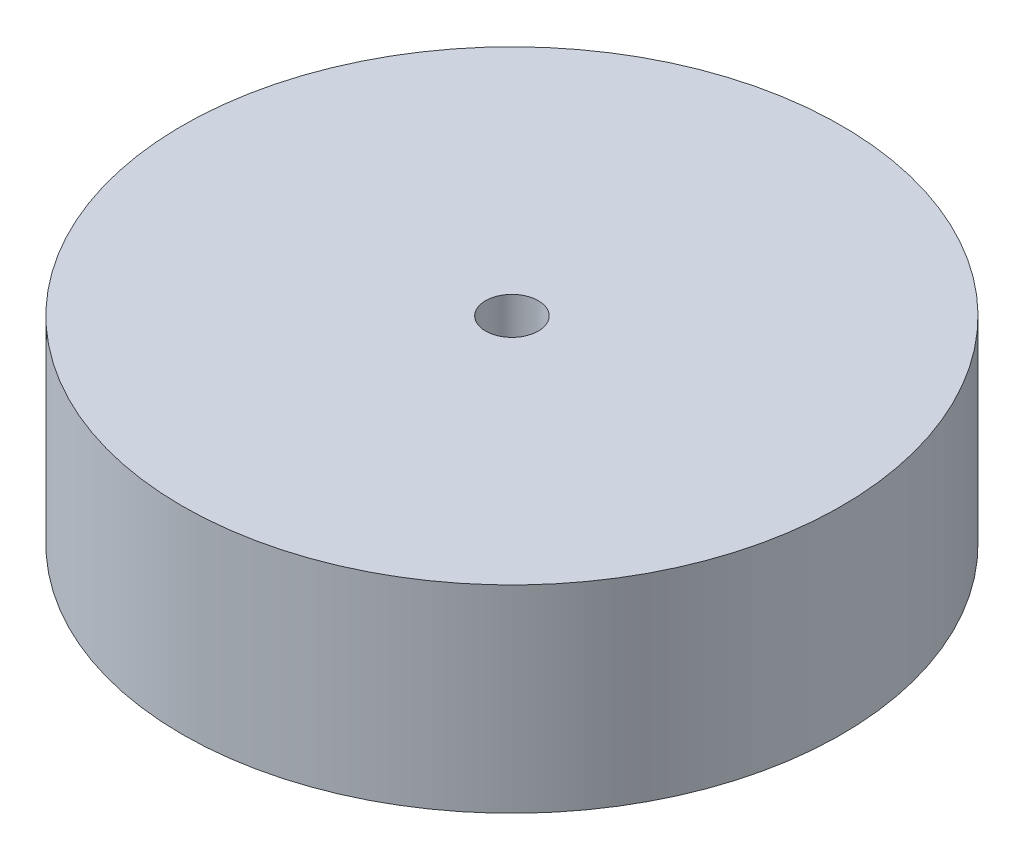
ISO-10303-21;
HEADER;
FILE_DESCRIPTION(('STEP AP214'),'2;1');
FILE_NAME('part.step','',(''),(''),'','','');
FILE_SCHEMA(('AUTOMOTIVE_DESIGN { 1 0 10303 214 1 1 1 1 }'));
ENDSEC;
DATA;
#1=APPLICATION_CONTEXT('core data for automotive mechanical design processes');
#2=APPLICATION_PROTOCOL_DEFINITION('international standard','automotive_design',2000,#1);
#3=PRODUCT_CONTEXT('',#1,'mechanical');
#4=PRODUCT('Part','Part','',(#3));
#5=PRODUCT_RELATED_PRODUCT_CATEGORY('part','',(#4));
#6=PRODUCT_DEFINITION_FORMATION('','',#4);
#7=PRODUCT_DEFINITION_CONTEXT('part definition',#1,'design');
#8=PRODUCT_DEFINITION('design','',#6,#7);
#9=PRODUCT_DEFINITION_SHAPE('','',#8);
#10=(LENGTH_UNIT() NAMED_UNIT(*) SI_UNIT(.MILLI.,.METRE.));
#11=(NAMED_UNIT(*) PLANE_ANGLE_UNIT() SI_UNIT($,.RADIAN.));
#12=(NAMED_UNIT(*) SI_UNIT($,.STERADIAN.) SOLID_ANGLE_UNIT());
#13=UNCERTAINTY_MEASURE_WITH_UNIT(LENGTH_MEASURE(1.E-05),#10,'distance_accuracy_value','');
#14=(GEOMETRIC_REPRESENTATION_CONTEXT(3) GLOBAL_UNCERTAINTY_ASSIGNED_CONTEXT((#13)) GLOBAL_UNIT_ASSIGNED_CONTEXT((#10,
#11,#12)) REPRESENTATION_CONTEXT('',''));
#15=CARTESIAN_POINT('',(0.,0.,0.));
#16=DIRECTION('',(0.,0.,1.));
#17=DIRECTION('',(1.,0.,0.));
#18=AXIS2_PLACEMENT_3D('',#15,#16,#17);
#19=CARTESIAN_POINT('',(0.,30.,0.));
#20=DIRECTION('',(0.,1.,0.));
#21=DIRECTION('',(0.,0.,1.));
#22=AXIS2_PLACEMENT_3D('',#19,#20,#21);
#23=PLANE('',#22);
#24=CARTESIAN_POINT('',(0.,30.,0.));
#25=DIRECTION('',(0.,1.,0.));
#26=DIRECTION('',(0.,0.,1.));
#27=AXIS2_PLACEMENT_3D('',#24,#25,#26);
#28=CIRCLE('',#27,50.);
#29=CARTESIAN_POINT('',(0.,30.,50.));
#30=VERTEX_POINT('',#29);
#31=EDGE_CURVE('E10',#30,#30,#28,.T.);
#32=ORIENTED_EDGE('',*,*,#31,.T.);
#33=EDGE_LOOP('',(#32));
#34=FACE_BOUND('',#33,.T.);
#35=CARTESIAN_POINT('',(0.,30.,0.));
#36=DIRECTION('',(0.,1.,0.));
#37=DIRECTION('',(0.,0.,1.));
#38=AXIS2_PLACEMENT_3D('',#35,#36,#37);
#39=CIRCLE('',#38,4.);
#40=CARTESIAN_POINT('',(0.,30.,4.));
#41=VERTEX_POINT('',#40);
#42=EDGE_CURVE('E46',#41,#41,#39,.T.);
#43=ORIENTED_EDGE('',*,*,#42,.F.);
#44=EDGE_LOOP('',(#43));
#45=FACE_BOUND('',#44,.T.);
#46=ADVANCED_FACE('F35',(#34,#45),#23,.T.);
#47=CARTESIAN_POINT('',(0.,0.,0.));
#48=DIRECTION('',(0.,1.,0.));
#49=DIRECTION('',(0.,0.,1.));
#50=AXIS2_PLACEMENT_3D('',#47,#48,#49);
#51=PLANE('',#50);
#52=CARTESIAN_POINT('',(0.,0.,0.));
#53=DIRECTION('',(0.,1.,0.));
#54=DIRECTION('',(0.,0.,1.));
#55=AXIS2_PLACEMENT_3D('',#52,#53,#54);
#56=CIRCLE('',#55,50.);
#57=CARTESIAN_POINT('',(0.,0.,50.));
#58=VERTEX_POINT('',#57);
#59=EDGE_CURVE('E39',#58,#58,#56,.T.);
#60=ORIENTED_EDGE('',*,*,#59,.F.);
#61=EDGE_LOOP('',(#60));
#62=FACE_BOUND('',#61,.T.);
#63=CARTESIAN_POINT('',(0.,0.,0.));
#64=DIRECTION('',(0.,1.,0.));
#65=DIRECTION('',(0.,0.,1.));
#66=AXIS2_PLACEMENT_3D('',#63,#64,#65);
#67=CIRCLE('',#66,4.);
#68=CARTESIAN_POINT('',(0.,0.,4.));
#69=VERTEX_POINT('',#68);
#70=EDGE_CURVE('E48',#69,#69,#67,.T.);
#71=ORIENTED_EDGE('',*,*,#70,.T.);
#72=EDGE_LOOP('',(#71));
#73=FACE_BOUND('',#72,.T.);
#74=ADVANCED_FACE('F58',(#62,#73),#51,.F.);
#75=CARTESIAN_POINT('',(0.,30.,0.));
#76=DIRECTION('',(0.,-1.,0.));
#77=DIRECTION('',(0.,0.,-1.));
#78=AXIS2_PLACEMENT_3D('',#75,#76,#77);
#79=CYLINDRICAL_SURFACE('',#78,50.);
#80=ORIENTED_EDGE('',*,*,#31,.F.);
#81=EDGE_LOOP('',(#80));
#82=FACE_BOUND('',#81,.T.);
#83=ORIENTED_EDGE('',*,*,#59,.T.);
#84=EDGE_LOOP('',(#83));
#85=FACE_BOUND('',#84,.T.);
#86=ADVANCED_FACE('F37',(#82,#85),#79,.T.);
#87=CARTESIAN_POINT('',(0.,30.,0.));
#88=DIRECTION('',(0.,-1.,0.));
#89=DIRECTION('',(0.,0.,-1.));
#90=AXIS2_PLACEMENT_3D('',#87,#88,#89);
#91=CYLINDRICAL_SURFACE('',#90,4.);
#92=ORIENTED_EDGE('',*,*,#42,.T.);
#93=EDGE_LOOP('',(#92));
#94=FACE_BOUND('',#93,.T.);
#95=ORIENTED_EDGE('',*,*,#70,.F.);
#96=EDGE_LOOP('',(#95));
#97=FACE_BOUND('',#96,.T.);
#98=ADVANCED_FACE('F54',(#94,#97),#91,.F.);
#99=CLOSED_SHELL('',(#46,#74,#86,#98));
#100=MANIFOLD_SOLID_BREP('B2',#99);
#101=ADVANCED_BREP_SHAPE_REPRESENTATION('',(#18,#100),#14);
#102=SHAPE_DEFINITION_REPRESENTATION(#9,#101);
ENDSEC;
END-ISO-10303-21;
